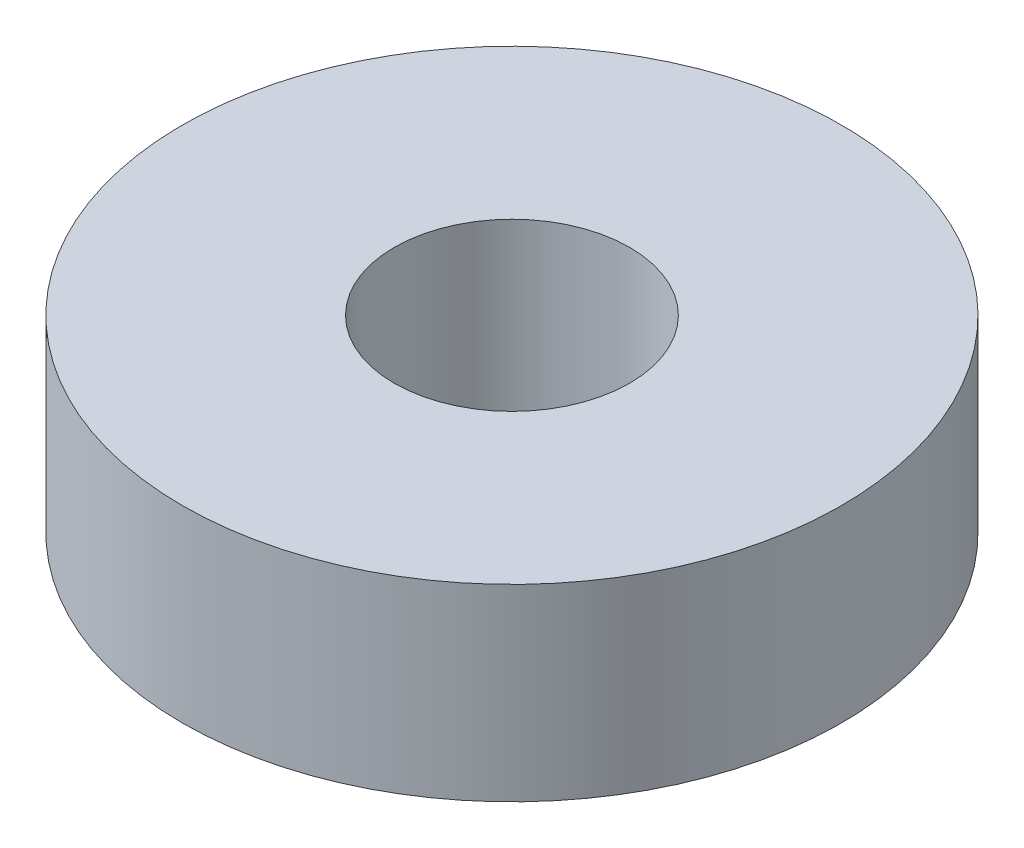
ISO-10303-21;
HEADER;
FILE_DESCRIPTION(('STEP AP214'),'2;1');
FILE_NAME('part.step','',(''),(''),'','','');
FILE_SCHEMA(('AUTOMOTIVE_DESIGN { 1 0 10303 214 1 1 1 1 }'));
ENDSEC;
DATA;
#1=APPLICATION_CONTEXT('core data for automotive mechanical design processes');
#2=APPLICATION_PROTOCOL_DEFINITION('international standard','automotive_design',2000,#1);
#3=PRODUCT_CONTEXT('',#1,'mechanical');
#4=PRODUCT('Part','Part','',(#3));
#5=PRODUCT_RELATED_PRODUCT_CATEGORY('part','',(#4));
#6=PRODUCT_DEFINITION_FORMATION('','',#4);
#7=PRODUCT_DEFINITION_CONTEXT('part definition',#1,'design');
#8=PRODUCT_DEFINITION('design','',#6,#7);
#9=PRODUCT_DEFINITION_SHAPE('','',#8);
#10=(LENGTH_UNIT() NAMED_UNIT(*) SI_UNIT(.MILLI.,.METRE.));
#11=(NAMED_UNIT(*) PLANE_ANGLE_UNIT() SI_UNIT($,.RADIAN.));
#12=(NAMED_UNIT(*) SI_UNIT($,.STERADIAN.) SOLID_ANGLE_UNIT());
#13=UNCERTAINTY_MEASURE_WITH_UNIT(LENGTH_MEASURE(1.E-05),#10,'distance_accuracy_value','');
#14=(GEOMETRIC_REPRESENTATION_CONTEXT(3) GLOBAL_UNCERTAINTY_ASSIGNED_CONTEXT((#13)) GLOBAL_UNIT_ASSIGNED_CONTEXT((#10,
#11,#12)) REPRESENTATION_CONTEXT('',''));
#15=CARTESIAN_POINT('',(0.,0.,0.));
#16=DIRECTION('',(0.,0.,1.));
#17=DIRECTION('',(1.,0.,0.));
#18=AXIS2_PLACEMENT_3D('',#15,#16,#17);
#19=CARTESIAN_POINT('',(0.,8.,0.));
#20=DIRECTION('',(0.,1.,0.));
#21=DIRECTION('',(0.,0.,1.));
#22=AXIS2_PLACEMENT_3D('',#19,#20,#21);
#23=PLANE('',#22);
#24=CARTESIAN_POINT('',(0.,8.,0.));
#25=DIRECTION('',(0.,1.,0.));
#26=DIRECTION('',(0.,0.,1.));
#27=AXIS2_PLACEMENT_3D('',#24,#25,#26);
#28=CIRCLE('',#27,14.);
#29=CARTESIAN_POINT('',(0.,8.,14.));
#30=VERTEX_POINT('',#29);
#31=EDGE_CURVE('E10',#30,#30,#28,.T.);
#32=ORIENTED_EDGE('',*,*,#31,.T.);
#33=EDGE_LOOP('',(#32));
#34=FACE_BOUND('',#33,.T.);
#35=CARTESIAN_POINT('',(0.,8.,0.));
#36=DIRECTION('',(0.,1.,0.));
#37=DIRECTION('',(0.,0.,1.));
#38=AXIS2_PLACEMENT_3D('',#35,#36,#37);
#39=CIRCLE('',#38,5.);
#40=CARTESIAN_POINT('',(0.,8.,5.));
#41=VERTEX_POINT('',#40);
#42=EDGE_CURVE('E50',#41,#41,#39,.T.);
#43=ORIENTED_EDGE('',*,*,#42,.F.);
#44=EDGE_LOOP('',(#43));
#45=FACE_BOUND('',#44,.T.);
#46=ADVANCED_FACE('F39',(#34,#45),#23,.T.);
#47=CARTESIAN_POINT('',(0.,0.,0.));
#48=DIRECTION('',(0.,1.,0.));
#49=DIRECTION('',(0.,0.,1.));
#50=AXIS2_PLACEMENT_3D('',#47,#48,#49);
#51=PLANE('',#50);
#52=CARTESIAN_POINT('',(0.,0.,0.));
#53=DIRECTION('',(0.,1.,0.));
#54=DIRECTION('',(0.,0.,1.));
#55=AXIS2_PLACEMENT_3D('',#52,#53,#54);
#56=CIRCLE('',#55,14.);
#57=CARTESIAN_POINT('',(0.,0.,14.));
#58=VERTEX_POINT('',#57);
#59=EDGE_CURVE('E43',#58,#58,#56,.T.);
#60=ORIENTED_EDGE('',*,*,#59,.F.);
#61=EDGE_LOOP('',(#60));
#62=FACE_BOUND('',#61,.T.);
#63=CARTESIAN_POINT('',(0.,0.,0.));
#64=DIRECTION('',(0.,1.,0.));
#65=DIRECTION('',(0.,0.,1.));
#66=AXIS2_PLACEMENT_3D('',#63,#64,#65);
#67=CIRCLE('',#66,5.);
#68=CARTESIAN_POINT('',(0.,0.,5.));
#69=VERTEX_POINT('',#68);
#70=EDGE_CURVE('E52',#69,#69,#67,.T.);
#71=ORIENTED_EDGE('',*,*,#70,.T.);
#72=EDGE_LOOP('',(#71));
#73=FACE_BOUND('',#72,.T.);
#74=ADVANCED_FACE('F62',(#62,#73),#51,.F.);
#75=CARTESIAN_POINT('',(0.,8.,0.));
#76=DIRECTION('',(0.,-1.,0.));
#77=DIRECTION('',(0.,0.,-1.));
#78=AXIS2_PLACEMENT_3D('',#75,#76,#77);
#79=CYLINDRICAL_SURFACE('',#78,14.);
#80=ORIENTED_EDGE('',*,*,#31,.F.);
#81=EDGE_LOOP('',(#80));
#82=FACE_BOUND('',#81,.T.);
#83=ORIENTED_EDGE('',*,*,#59,.T.);
#84=EDGE_LOOP('',(#83));
#85=FACE_BOUND('',#84,.T.);
#86=ADVANCED_FACE('F41',(#82,#85),#79,.T.);
#87=CARTESIAN_POINT('',(0.,8.,0.));
#88=DIRECTION('',(0.,-1.,0.));
#89=DIRECTION('',(0.,0.,-1.));
#90=AXIS2_PLACEMENT_3D('',#87,#88,#89);
#91=CYLINDRICAL_SURFACE('',#90,5.);
#92=ORIENTED_EDGE('',*,*,#42,.T.);
#93=EDGE_LOOP('',(#92));
#94=FACE_BOUND('',#93,.T.);
#95=ORIENTED_EDGE('',*,*,#70,.F.);
#96=EDGE_LOOP('',(#95));
#97=FACE_BOUND('',#96,.T.);
#98=ADVANCED_FACE('F58',(#94,#97),#91,.F.);
#99=CLOSED_SHELL('',(#46,#74,#86,#98));
#100=MANIFOLD_SOLID_BREP('B2',#99);
#101=ADVANCED_BREP_SHAPE_REPRESENTATION('',(#18,#100),#14);
#102=SHAPE_DEFINITION_REPRESENTATION(#9,#101);
ENDSEC;
END-ISO-10303-21;
